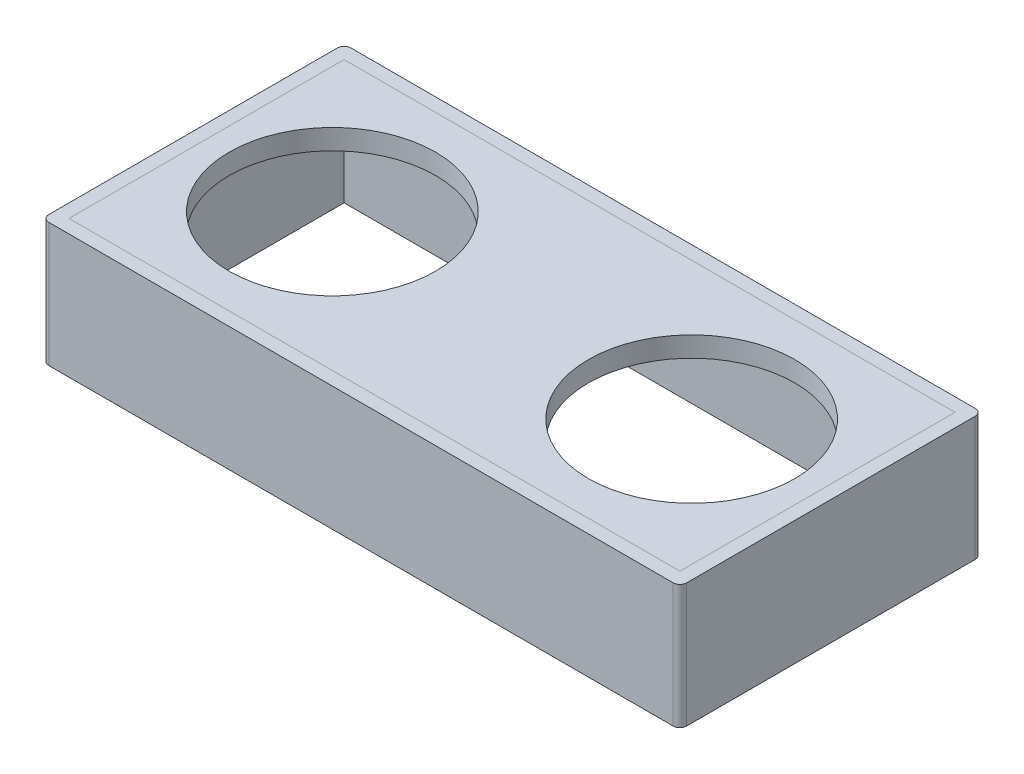
ISO-10303-21;
HEADER;
FILE_DESCRIPTION(('STEP AP214'),'2;1');
FILE_NAME('part.step','',(''),(''),'','','');
FILE_SCHEMA(('AUTOMOTIVE_DESIGN { 1 0 10303 214 1 1 1 1 }'));
ENDSEC;
DATA;
#1=APPLICATION_CONTEXT('core data for automotive mechanical design processes');
#2=APPLICATION_PROTOCOL_DEFINITION('international standard','automotive_design',2000,#1);
#3=PRODUCT_CONTEXT('',#1,'mechanical');
#4=PRODUCT('Part','Part','',(#3));
#5=PRODUCT_RELATED_PRODUCT_CATEGORY('part','',(#4));
#6=PRODUCT_DEFINITION_FORMATION('','',#4);
#7=PRODUCT_DEFINITION_CONTEXT('part definition',#1,'design');
#8=PRODUCT_DEFINITION('design','',#6,#7);
#9=PRODUCT_DEFINITION_SHAPE('','',#8);
#10=(LENGTH_UNIT() NAMED_UNIT(*) SI_UNIT(.MILLI.,.METRE.));
#11=(NAMED_UNIT(*) PLANE_ANGLE_UNIT() SI_UNIT($,.RADIAN.));
#12=(NAMED_UNIT(*) SI_UNIT($,.STERADIAN.) SOLID_ANGLE_UNIT());
#13=UNCERTAINTY_MEASURE_WITH_UNIT(LENGTH_MEASURE(1.E-05),#10,'distance_accuracy_value','');
#14=(GEOMETRIC_REPRESENTATION_CONTEXT(3) GLOBAL_UNCERTAINTY_ASSIGNED_CONTEXT((#13)) GLOBAL_UNIT_ASSIGNED_CONTEXT((#10,
#11,#12)) REPRESENTATION_CONTEXT('',''));
#15=CARTESIAN_POINT('',(0.,0.,0.));
#16=DIRECTION('',(0.,0.,1.));
#17=DIRECTION('',(1.,0.,0.));
#18=AXIS2_PLACEMENT_3D('',#15,#16,#17);
#19=CARTESIAN_POINT('',(24.0480834335101,53.8359341179653,10.2231229798815));
#20=DIRECTION('',(0.,-1.,0.));
#21=DIRECTION('',(0.,0.,-1.));
#22=AXIS2_PLACEMENT_3D('',#19,#20,#21);
#23=CYLINDRICAL_SURFACE('',#22,0.5);
#24=DIRECTION('',(0.,-1.,0.));
#25=VECTOR('',#24,1.);
#26=CARTESIAN_POINT('',(24.5480834335101,53.8359341179653,10.2231229798815));
#27=LINE('',#26,#25);
#28=CARTESIAN_POINT('',(24.5480834335101,1.5,10.2231229798815));
#29=VERTEX_POINT('',#28);
#30=CARTESIAN_POINT('',(24.5480834335101,-7.7,10.2231229798815));
#31=VERTEX_POINT('',#30);
#32=EDGE_CURVE('E194',#29,#31,#27,.T.);
#33=ORIENTED_EDGE('',*,*,#32,.F.);
#34=CARTESIAN_POINT('',(24.0480834335101,1.5,10.2231229798815));
#35=DIRECTION('',(0.,1.,0.));
#36=DIRECTION('',(0.,0.,1.));
#37=AXIS2_PLACEMENT_3D('',#34,#35,#36);
#38=CIRCLE('',#37,0.5);
#39=CARTESIAN_POINT('',(24.0480834335101,1.5,10.7231229798815));
#40=VERTEX_POINT('',#39);
#41=EDGE_CURVE('E181',#29,#40,#38,.F.);
#42=ORIENTED_EDGE('',*,*,#41,.T.);
#43=DIRECTION('',(0.,-1.,0.));
#44=VECTOR('',#43,1.);
#45=CARTESIAN_POINT('',(24.0480834335101,53.8359341179653,10.7231229798815));
#46=LINE('',#45,#44);
#47=CARTESIAN_POINT('',(24.0480834335101,-7.7,10.7231229798815));
#48=VERTEX_POINT('',#47);
#49=EDGE_CURVE('E190',#40,#48,#46,.T.);
#50=ORIENTED_EDGE('',*,*,#49,.T.);
#51=CARTESIAN_POINT('',(24.0480834335101,-7.7,10.2231229798815));
#52=DIRECTION('',(0.,-1.,0.));
#53=DIRECTION('',(0.,0.,-1.));
#54=AXIS2_PLACEMENT_3D('',#51,#52,#53);
#55=CIRCLE('',#54,0.5);
#56=EDGE_CURVE('E157',#31,#48,#55,.T.);
#57=ORIENTED_EDGE('',*,*,#56,.F.);
#58=EDGE_LOOP('',(#33,#42,#50,#57));
#59=FACE_BOUND('',#58,.T.);
#60=ADVANCED_FACE('F43',(#59),#23,.T.);
#61=CARTESIAN_POINT('',(24.5480834335101,53.8359341179653,-11.1768770201185));
#62=DIRECTION('',(1.,0.,0.));
#63=DIRECTION('',(0.,0.,-1.));
#64=AXIS2_PLACEMENT_3D('',#61,#62,#63);
#65=PLANE('',#64);
#66=DIRECTION('',(0.,-1.,0.));
#67=VECTOR('',#66,1.);
#68=CARTESIAN_POINT('',(24.5480834335101,53.8359341179653,-11.1768770201185));
#69=LINE('',#68,#67);
#70=CARTESIAN_POINT('',(24.5480834335101,1.5,-11.1768770201185));
#71=VERTEX_POINT('',#70);
#72=CARTESIAN_POINT('',(24.5480834335101,-7.7,-11.1768770201185));
#73=VERTEX_POINT('',#72);
#74=EDGE_CURVE('E198',#71,#73,#69,.T.);
#75=ORIENTED_EDGE('',*,*,#74,.F.);
#76=DIRECTION('',(0.,0.,1.));
#77=VECTOR('',#76,1.);
#78=CARTESIAN_POINT('',(24.5480834335101,1.5,-11.1768770201185));
#79=LINE('',#78,#77);
#80=EDGE_CURVE('E191',#71,#29,#79,.T.);
#81=ORIENTED_EDGE('',*,*,#80,.T.);
#82=ORIENTED_EDGE('',*,*,#32,.T.);
#83=DIRECTION('',(0.,0.,1.));
#84=VECTOR('',#83,1.);
#85=CARTESIAN_POINT('',(24.5480834335101,-7.7,-11.1768770201185));
#86=LINE('',#85,#84);
#87=EDGE_CURVE('E178',#73,#31,#86,.T.);
#88=ORIENTED_EDGE('',*,*,#87,.F.);
#89=EDGE_LOOP('',(#75,#81,#82,#88));
#90=FACE_BOUND('',#89,.T.);
#91=ADVANCED_FACE('F241',(#90),#65,.T.);
#92=CARTESIAN_POINT('',(24.0480834335101,53.8359341179653,-11.1768770201185));
#93=DIRECTION('',(0.,-1.,0.));
#94=DIRECTION('',(0.,0.,-1.));
#95=AXIS2_PLACEMENT_3D('',#92,#93,#94);
#96=CYLINDRICAL_SURFACE('',#95,0.5);
#97=DIRECTION('',(0.,-1.,0.));
#98=VECTOR('',#97,1.);
#99=CARTESIAN_POINT('',(24.0480834335101,53.8359341179653,-11.6768770201185));
#100=LINE('',#99,#98);
#101=CARTESIAN_POINT('',(24.0480834335101,1.5,-11.6768770201185));
#102=VERTEX_POINT('',#101);
#103=CARTESIAN_POINT('',(24.0480834335101,-7.7,-11.6768770201185));
#104=VERTEX_POINT('',#103);
#105=EDGE_CURVE('E202',#102,#104,#100,.T.);
#106=ORIENTED_EDGE('',*,*,#105,.F.);
#107=CARTESIAN_POINT('',(24.0480834335101,1.5,-11.1768770201185));
#108=DIRECTION('',(0.,1.,0.));
#109=DIRECTION('',(0.,0.,1.));
#110=AXIS2_PLACEMENT_3D('',#107,#108,#109);
#111=CIRCLE('',#110,0.5);
#112=EDGE_CURVE('E195',#102,#71,#111,.F.);
#113=ORIENTED_EDGE('',*,*,#112,.T.);
#114=ORIENTED_EDGE('',*,*,#74,.T.);
#115=CARTESIAN_POINT('',(24.0480834335101,-7.7,-11.1768770201185));
#116=DIRECTION('',(0.,-1.,0.));
#117=DIRECTION('',(0.,0.,-1.));
#118=AXIS2_PLACEMENT_3D('',#115,#116,#117);
#119=CIRCLE('',#118,0.5);
#120=EDGE_CURVE('E175',#104,#73,#119,.T.);
#121=ORIENTED_EDGE('',*,*,#120,.F.);
#122=EDGE_LOOP('',(#106,#113,#114,#121));
#123=FACE_BOUND('',#122,.T.);
#124=ADVANCED_FACE('F247',(#123),#96,.T.);
#125=CARTESIAN_POINT('',(-22.2519165664899,53.8359341179653,-11.6768770201185));
#126=DIRECTION('',(0.,0.,-1.));
#127=DIRECTION('',(-1.,0.,0.));
#128=AXIS2_PLACEMENT_3D('',#125,#126,#127);
#129=PLANE('',#128);
#130=DIRECTION('',(0.,-1.,0.));
#131=VECTOR('',#130,1.);
#132=CARTESIAN_POINT('',(-22.2519165664899,53.8359341179653,-11.6768770201185));
#133=LINE('',#132,#131);
#134=CARTESIAN_POINT('',(-22.2519165664899,1.5,-11.6768770201185));
#135=VERTEX_POINT('',#134);
#136=CARTESIAN_POINT('',(-22.2519165664899,-7.7,-11.6768770201185));
#137=VERTEX_POINT('',#136);
#138=EDGE_CURVE('E206',#135,#137,#133,.T.);
#139=ORIENTED_EDGE('',*,*,#138,.F.);
#140=DIRECTION('',(1.,0.,0.));
#141=VECTOR('',#140,1.);
#142=CARTESIAN_POINT('',(-22.2519165664899,1.5,-11.6768770201185));
#143=LINE('',#142,#141);
#144=EDGE_CURVE('E199',#135,#102,#143,.T.);
#145=ORIENTED_EDGE('',*,*,#144,.T.);
#146=ORIENTED_EDGE('',*,*,#105,.T.);
#147=DIRECTION('',(1.,0.,0.));
#148=VECTOR('',#147,1.);
#149=CARTESIAN_POINT('',(-22.2519165664899,-7.7,-11.6768770201185));
#150=LINE('',#149,#148);
#151=EDGE_CURVE('E172',#137,#104,#150,.T.);
#152=ORIENTED_EDGE('',*,*,#151,.F.);
#153=EDGE_LOOP('',(#139,#145,#146,#152));
#154=FACE_BOUND('',#153,.T.);
#155=ADVANCED_FACE('F273',(#154),#129,.T.);
#156=CARTESIAN_POINT('',(-22.2519165664899,53.8359341179653,-11.1768770201185));
#157=DIRECTION('',(0.,-1.,0.));
#158=DIRECTION('',(0.,0.,-1.));
#159=AXIS2_PLACEMENT_3D('',#156,#157,#158);
#160=CYLINDRICAL_SURFACE('',#159,0.5);
#161=DIRECTION('',(0.,-1.,0.));
#162=VECTOR('',#161,1.);
#163=CARTESIAN_POINT('',(-22.7519165664899,53.8359341179653,-11.1768770201185));
#164=LINE('',#163,#162);
#165=CARTESIAN_POINT('',(-22.7519165664899,1.5,-11.1768770201185));
#166=VERTEX_POINT('',#165);
#167=CARTESIAN_POINT('',(-22.7519165664899,-7.7,-11.1768770201185));
#168=VERTEX_POINT('',#167);
#169=EDGE_CURVE('E210',#166,#168,#164,.T.);
#170=ORIENTED_EDGE('',*,*,#169,.F.);
#171=CARTESIAN_POINT('',(-22.2519165664899,1.5,-11.1768770201185));
#172=DIRECTION('',(0.,1.,0.));
#173=DIRECTION('',(0.,0.,1.));
#174=AXIS2_PLACEMENT_3D('',#171,#172,#173);
#175=CIRCLE('',#174,0.5);
#176=EDGE_CURVE('E203',#166,#135,#175,.F.);
#177=ORIENTED_EDGE('',*,*,#176,.T.);
#178=ORIENTED_EDGE('',*,*,#138,.T.);
#179=CARTESIAN_POINT('',(-22.2519165664899,-7.7,-11.1768770201185));
#180=DIRECTION('',(0.,-1.,0.));
#181=DIRECTION('',(0.,0.,-1.));
#182=AXIS2_PLACEMENT_3D('',#179,#180,#181);
#183=CIRCLE('',#182,0.5);
#184=EDGE_CURVE('E169',#168,#137,#183,.T.);
#185=ORIENTED_EDGE('',*,*,#184,.F.);
#186=EDGE_LOOP('',(#170,#177,#178,#185));
#187=FACE_BOUND('',#186,.T.);
#188=ADVANCED_FACE('F276',(#187),#160,.T.);
#189=CARTESIAN_POINT('',(-22.7519165664899,53.8359341179653,10.2231229798815));
#190=DIRECTION('',(-1.,0.,0.));
#191=DIRECTION('',(0.,0.,1.));
#192=AXIS2_PLACEMENT_3D('',#189,#190,#191);
#193=PLANE('',#192);
#194=DIRECTION('',(0.,-1.,0.));
#195=VECTOR('',#194,1.);
#196=CARTESIAN_POINT('',(-22.7519165664899,53.8359341179653,10.2231229798815));
#197=LINE('',#196,#195);
#198=CARTESIAN_POINT('',(-22.7519165664899,1.5,10.2231229798815));
#199=VERTEX_POINT('',#198);
#200=CARTESIAN_POINT('',(-22.7519165664899,-7.7,10.2231229798815));
#201=VERTEX_POINT('',#200);
#202=EDGE_CURVE('E184',#199,#201,#197,.T.);
#203=ORIENTED_EDGE('',*,*,#202,.F.);
#204=DIRECTION('',(0.,0.,-1.));
#205=VECTOR('',#204,1.);
#206=CARTESIAN_POINT('',(-22.7519165664899,1.5,10.2231229798815));
#207=LINE('',#206,#205);
#208=EDGE_CURVE('E207',#199,#166,#207,.T.);
#209=ORIENTED_EDGE('',*,*,#208,.T.);
#210=ORIENTED_EDGE('',*,*,#169,.T.);
#211=DIRECTION('',(0.,0.,-1.));
#212=VECTOR('',#211,1.);
#213=CARTESIAN_POINT('',(-22.7519165664899,-7.7,10.2231229798815));
#214=LINE('',#213,#212);
#215=EDGE_CURVE('E166',#201,#168,#214,.T.);
#216=ORIENTED_EDGE('',*,*,#215,.F.);
#217=EDGE_LOOP('',(#203,#209,#210,#216));
#218=FACE_BOUND('',#217,.T.);
#219=ADVANCED_FACE('F280',(#218),#193,.T.);
#220=CARTESIAN_POINT('',(-22.2519165664899,53.8359341179653,10.2231229798815));
#221=DIRECTION('',(0.,-1.,0.));
#222=DIRECTION('',(0.,0.,-1.));
#223=AXIS2_PLACEMENT_3D('',#220,#221,#222);
#224=CYLINDRICAL_SURFACE('',#223,0.5);
#225=DIRECTION('',(0.,-1.,0.));
#226=VECTOR('',#225,1.);
#227=CARTESIAN_POINT('',(-22.2519165664899,53.8359341179653,10.7231229798815));
#228=LINE('',#227,#226);
#229=CARTESIAN_POINT('',(-22.2519165664899,1.5,10.7231229798815));
#230=VERTEX_POINT('',#229);
#231=CARTESIAN_POINT('',(-22.2519165664899,-7.7,10.7231229798815));
#232=VERTEX_POINT('',#231);
#233=EDGE_CURVE('E183',#230,#232,#228,.T.);
#234=ORIENTED_EDGE('',*,*,#233,.F.);
#235=CARTESIAN_POINT('',(-22.2519165664899,1.5,10.2231229798815));
#236=DIRECTION('',(0.,1.,0.));
#237=DIRECTION('',(0.,0.,1.));
#238=AXIS2_PLACEMENT_3D('',#235,#236,#237);
#239=CIRCLE('',#238,0.5);
#240=EDGE_CURVE('E211',#230,#199,#239,.F.);
#241=ORIENTED_EDGE('',*,*,#240,.T.);
#242=ORIENTED_EDGE('',*,*,#202,.T.);
#243=CARTESIAN_POINT('',(-22.2519165664899,-7.7,10.2231229798815));
#244=DIRECTION('',(0.,-1.,0.));
#245=DIRECTION('',(0.,0.,1.));
#246=AXIS2_PLACEMENT_3D('',#243,#244,#245);
#247=CIRCLE('',#246,0.5);
#248=EDGE_CURVE('E163',#232,#201,#247,.T.);
#249=ORIENTED_EDGE('',*,*,#248,.F.);
#250=EDGE_LOOP('',(#234,#241,#242,#249));
#251=FACE_BOUND('',#250,.T.);
#252=ADVANCED_FACE('F284',(#251),#224,.T.);
#253=CARTESIAN_POINT('',(24.0480834335101,53.8359341179653,10.7231229798815));
#254=DIRECTION('',(0.,0.,1.));
#255=DIRECTION('',(1.,0.,0.));
#256=AXIS2_PLACEMENT_3D('',#253,#254,#255);
#257=PLANE('',#256);
#258=ORIENTED_EDGE('',*,*,#49,.F.);
#259=DIRECTION('',(-1.,0.,0.));
#260=VECTOR('',#259,1.);
#261=CARTESIAN_POINT('',(24.0480834335101,1.5,10.7231229798815));
#262=LINE('',#261,#260);
#263=EDGE_CURVE('E61',#40,#230,#262,.T.);
#264=ORIENTED_EDGE('',*,*,#263,.T.);
#265=ORIENTED_EDGE('',*,*,#233,.T.);
#266=DIRECTION('',(-1.,0.,0.));
#267=VECTOR('',#266,1.);
#268=CARTESIAN_POINT('',(24.0480834335101,-7.7,10.7231229798815));
#269=LINE('',#268,#267);
#270=EDGE_CURVE('E160',#48,#232,#269,.T.);
#271=ORIENTED_EDGE('',*,*,#270,.F.);
#272=EDGE_LOOP('',(#258,#264,#265,#271));
#273=FACE_BOUND('',#272,.T.);
#274=ADVANCED_FACE('F239',(#273),#257,.T.);
#275=CARTESIAN_POINT('',(23.5480834335101,53.8359341179653,9.72312297988152));
#276=DIRECTION('',(0.,0.,1.));
#277=DIRECTION('',(1.,0.,0.));
#278=AXIS2_PLACEMENT_3D('',#275,#276,#277);
#279=PLANE('',#278);
#280=DIRECTION('',(-1.,0.,0.));
#281=VECTOR('',#280,1.);
#282=CARTESIAN_POINT('',(23.5480834335101,1.5,9.72312297988152));
#283=LINE('',#282,#281);
#284=CARTESIAN_POINT('',(23.5480834335101,1.5,9.72312297988152));
#285=VERTEX_POINT('',#284);
#286=CARTESIAN_POINT('',(-21.7519165664899,1.5,9.72312297988152));
#287=VERTEX_POINT('',#286);
#288=EDGE_CURVE('E185',#285,#287,#283,.T.);
#289=ORIENTED_EDGE('',*,*,#288,.F.);
#290=DIRECTION('',(0.,-1.,0.));
#291=VECTOR('',#290,1.);
#292=CARTESIAN_POINT('',(23.5480834335101,53.8359341179653,9.72312297988152));
#293=LINE('',#292,#291);
#294=CARTESIAN_POINT('',(23.5480834335101,-7.7,9.72312297988152));
#295=VERTEX_POINT('',#294);
#296=EDGE_CURVE('E144',#285,#295,#293,.T.);
#297=ORIENTED_EDGE('',*,*,#296,.T.);
#298=DIRECTION('',(-1.,0.,0.));
#299=VECTOR('',#298,1.);
#300=CARTESIAN_POINT('',(23.5480834335101,-7.7,9.72312297988152));
#301=LINE('',#300,#299);
#302=CARTESIAN_POINT('',(-21.7519165664899,-7.7,9.72312297988152));
#303=VERTEX_POINT('',#302);
#304=EDGE_CURVE('E141',#295,#303,#301,.T.);
#305=ORIENTED_EDGE('',*,*,#304,.T.);
#306=DIRECTION('',(0.,-1.,0.));
#307=VECTOR('',#306,1.);
#308=CARTESIAN_POINT('',(-21.7519165664899,53.8359341179653,9.72312297988152));
#309=LINE('',#308,#307);
#310=EDGE_CURVE('E47',#287,#303,#309,.T.);
#311=ORIENTED_EDGE('',*,*,#310,.F.);
#312=EDGE_LOOP('',(#289,#297,#305,#311));
#313=FACE_BOUND('',#312,.T.);
#314=ADVANCED_FACE('F142',(#313),#279,.F.);
#315=CARTESIAN_POINT('',(23.5480834335101,53.8359341179653,-10.6768770201185));
#316=DIRECTION('',(1.,0.,0.));
#317=DIRECTION('',(0.,0.,-1.));
#318=AXIS2_PLACEMENT_3D('',#315,#316,#317);
#319=PLANE('',#318);
#320=DIRECTION('',(0.,0.,1.));
#321=VECTOR('',#320,1.);
#322=CARTESIAN_POINT('',(23.5480834335101,1.5,-10.6768770201185));
#323=LINE('',#322,#321);
#324=CARTESIAN_POINT('',(23.5480834335101,1.5,-10.6768770201185));
#325=VERTEX_POINT('',#324);
#326=EDGE_CURVE('E138',#325,#285,#323,.T.);
#327=ORIENTED_EDGE('',*,*,#326,.F.);
#328=DIRECTION('',(0.,-1.,0.));
#329=VECTOR('',#328,1.);
#330=CARTESIAN_POINT('',(23.5480834335101,53.8359341179653,-10.6768770201185));
#331=LINE('',#330,#329);
#332=CARTESIAN_POINT('',(23.5480834335101,-7.7,-10.6768770201185));
#333=VERTEX_POINT('',#332);
#334=EDGE_CURVE('E224',#325,#333,#331,.T.);
#335=ORIENTED_EDGE('',*,*,#334,.T.);
#336=DIRECTION('',(0.,0.,1.));
#337=VECTOR('',#336,1.);
#338=CARTESIAN_POINT('',(23.5480834335101,-7.7,-10.6768770201185));
#339=LINE('',#338,#337);
#340=EDGE_CURVE('E153',#333,#295,#339,.T.);
#341=ORIENTED_EDGE('',*,*,#340,.T.);
#342=ORIENTED_EDGE('',*,*,#296,.F.);
#343=EDGE_LOOP('',(#327,#335,#341,#342));
#344=FACE_BOUND('',#343,.T.);
#345=ADVANCED_FACE('F231',(#344),#319,.F.);
#346=CARTESIAN_POINT('',(-21.7519165664899,53.8359341179653,-10.6768770201185));
#347=DIRECTION('',(0.,0.,-1.));
#348=DIRECTION('',(-1.,0.,0.));
#349=AXIS2_PLACEMENT_3D('',#346,#347,#348);
#350=PLANE('',#349);
#351=DIRECTION('',(1.,0.,0.));
#352=VECTOR('',#351,1.);
#353=CARTESIAN_POINT('',(-21.7519165664899,1.5,-10.6768770201185));
#354=LINE('',#353,#352);
#355=CARTESIAN_POINT('',(-21.7519165664899,1.5,-10.6768770201185));
#356=VERTEX_POINT('',#355);
#357=EDGE_CURVE('E12',#356,#325,#354,.T.);
#358=ORIENTED_EDGE('',*,*,#357,.F.);
#359=DIRECTION('',(0.,-1.,0.));
#360=VECTOR('',#359,1.);
#361=CARTESIAN_POINT('',(-21.7519165664899,53.8359341179653,-10.6768770201185));
#362=LINE('',#361,#360);
#363=CARTESIAN_POINT('',(-21.7519165664899,-7.7,-10.6768770201185));
#364=VERTEX_POINT('',#363);
#365=EDGE_CURVE('E139',#356,#364,#362,.T.);
#366=ORIENTED_EDGE('',*,*,#365,.T.);
#367=DIRECTION('',(1.,0.,0.));
#368=VECTOR('',#367,1.);
#369=CARTESIAN_POINT('',(-21.7519165664899,-7.7,-10.6768770201185));
#370=LINE('',#369,#368);
#371=EDGE_CURVE('E151',#364,#333,#370,.T.);
#372=ORIENTED_EDGE('',*,*,#371,.T.);
#373=ORIENTED_EDGE('',*,*,#334,.F.);
#374=EDGE_LOOP('',(#358,#366,#372,#373));
#375=FACE_BOUND('',#374,.T.);
#376=ADVANCED_FACE('F227',(#375),#350,.F.);
#377=CARTESIAN_POINT('',(-21.7519165664899,53.8359341179653,9.72312297988152));
#378=DIRECTION('',(-1.,0.,0.));
#379=DIRECTION('',(0.,0.,1.));
#380=AXIS2_PLACEMENT_3D('',#377,#378,#379);
#381=PLANE('',#380);
#382=DIRECTION('',(0.,0.,-1.));
#383=VECTOR('',#382,1.);
#384=CARTESIAN_POINT('',(-21.7519165664899,1.5,9.72312297988152));
#385=LINE('',#384,#383);
#386=EDGE_CURVE('E53',#287,#356,#385,.T.);
#387=ORIENTED_EDGE('',*,*,#386,.F.);
#388=ORIENTED_EDGE('',*,*,#310,.T.);
#389=DIRECTION('',(0.,0.,-1.));
#390=VECTOR('',#389,1.);
#391=CARTESIAN_POINT('',(-21.7519165664899,-7.7,9.72312297988152));
#392=LINE('',#391,#390);
#393=EDGE_CURVE('E133',#303,#364,#392,.T.);
#394=ORIENTED_EDGE('',*,*,#393,.T.);
#395=ORIENTED_EDGE('',*,*,#365,.F.);
#396=EDGE_LOOP('',(#387,#388,#394,#395));
#397=FACE_BOUND('',#396,.T.);
#398=ADVANCED_FACE('F130',(#397),#381,.F.);
#399=CARTESIAN_POINT('',(0.,1.5,0.));
#400=DIRECTION('',(0.,1.,0.));
#401=DIRECTION('',(0.,0.,1.));
#402=AXIS2_PLACEMENT_3D('',#399,#400,#401);
#403=PLANE('',#402);
#404=ORIENTED_EDGE('',*,*,#41,.F.);
#405=ORIENTED_EDGE('',*,*,#80,.F.);
#406=ORIENTED_EDGE('',*,*,#112,.F.);
#407=ORIENTED_EDGE('',*,*,#144,.F.);
#408=ORIENTED_EDGE('',*,*,#176,.F.);
#409=ORIENTED_EDGE('',*,*,#208,.F.);
#410=ORIENTED_EDGE('',*,*,#240,.F.);
#411=ORIENTED_EDGE('',*,*,#263,.F.);
#412=EDGE_LOOP('',(#404,#405,#406,#407,#408,#409,#410,#411));
#413=FACE_BOUND('',#412,.T.);
#414=ORIENTED_EDGE('',*,*,#326,.T.);
#415=ORIENTED_EDGE('',*,*,#288,.T.);
#416=ORIENTED_EDGE('',*,*,#386,.T.);
#417=ORIENTED_EDGE('',*,*,#357,.T.);
#418=EDGE_LOOP('',(#414,#415,#416,#417));
#419=FACE_BOUND('',#418,.T.);
#420=ADVANCED_FACE('F45',(#413,#419),#403,.T.);
#421=CARTESIAN_POINT('',(24.0480834335101,-7.7,10.2231229798815));
#422=DIRECTION('',(0.,-1.,0.));
#423=DIRECTION('',(0.,0.,-1.));
#424=AXIS2_PLACEMENT_3D('',#421,#422,#423);
#425=PLANE('',#424);
#426=ORIENTED_EDGE('',*,*,#56,.T.);
#427=ORIENTED_EDGE('',*,*,#270,.T.);
#428=ORIENTED_EDGE('',*,*,#248,.T.);
#429=ORIENTED_EDGE('',*,*,#215,.T.);
#430=ORIENTED_EDGE('',*,*,#184,.T.);
#431=ORIENTED_EDGE('',*,*,#151,.T.);
#432=ORIENTED_EDGE('',*,*,#120,.T.);
#433=ORIENTED_EDGE('',*,*,#87,.T.);
#434=EDGE_LOOP('',(#426,#427,#428,#429,#430,#431,#432,#433));
#435=FACE_BOUND('',#434,.T.);
#436=ORIENTED_EDGE('',*,*,#393,.F.);
#437=ORIENTED_EDGE('',*,*,#304,.F.);
#438=ORIENTED_EDGE('',*,*,#340,.F.);
#439=ORIENTED_EDGE('',*,*,#371,.F.);
#440=EDGE_LOOP('',(#436,#437,#438,#439));
#441=FACE_BOUND('',#440,.T.);
#442=ADVANCED_FACE('F149',(#435,#441),#425,.T.);
#443=CLOSED_SHELL('',(#60,#91,#124,#155,#188,#219,#252,#274,#314,#345,#376,#398,#420,#442));
#444=MANIFOLD_SOLID_BREP('B2',#443);
#445=CARTESIAN_POINT('',(0.,1.5,0.));
#446=DIRECTION('',(0.,1.,0.));
#447=DIRECTION('',(0.,0.,1.));
#448=AXIS2_PLACEMENT_3D('',#445,#446,#447);
#449=PLANE('',#448);
#450=CARTESIAN_POINT('',(14.2180834335101,1.5,-0.476877020118483));
#451=DIRECTION('',(0.,1.,0.));
#452=DIRECTION('',(0.,0.,1.));
#453=AXIS2_PLACEMENT_3D('',#450,#451,#452);
#454=CIRCLE('',#453,7.65);
#455=CARTESIAN_POINT('',(14.2180834335101,1.5,7.17312297988152));
#456=VERTEX_POINT('',#455);
#457=EDGE_CURVE('E444',#456,#456,#454,.T.);
#458=ORIENTED_EDGE('',*,*,#457,.F.);
#459=EDGE_LOOP('',(#458));
#460=FACE_BOUND('',#459,.T.);
#461=DIRECTION('',(0.,0.,1.));
#462=VECTOR('',#461,1.);
#463=CARTESIAN_POINT('',(-21.7519165664899,1.5,-10.6768770201185));
#464=LINE('',#463,#462);
#465=CARTESIAN_POINT('',(-21.7519165664899,1.5,-10.6768770201185));
#466=VERTEX_POINT('',#465);
#467=CARTESIAN_POINT('',(-21.7519165664899,1.5,9.72312297988152));
#468=VERTEX_POINT('',#467);
#469=EDGE_CURVE('E429',#466,#468,#464,.T.);
#470=ORIENTED_EDGE('',*,*,#469,.T.);
#471=DIRECTION('',(1.,0.,0.));
#472=VECTOR('',#471,1.);
#473=CARTESIAN_POINT('',(-21.7519165664899,1.5,9.72312297988152));
#474=LINE('',#473,#472);
#475=CARTESIAN_POINT('',(23.5480834335101,1.5,9.72312297988152));
#476=VERTEX_POINT('',#475);
#477=EDGE_CURVE('E424',#468,#476,#474,.T.);
#478=ORIENTED_EDGE('',*,*,#477,.T.);
#479=DIRECTION('',(0.,0.,-1.));
#480=VECTOR('',#479,1.);
#481=CARTESIAN_POINT('',(23.5480834335101,1.5,9.72312297988152));
#482=LINE('',#481,#480);
#483=CARTESIAN_POINT('',(23.5480834335101,1.5,-10.6768770201185));
#484=VERTEX_POINT('',#483);
#485=EDGE_CURVE('E427',#476,#484,#482,.T.);
#486=ORIENTED_EDGE('',*,*,#485,.T.);
#487=DIRECTION('',(-1.,0.,0.));
#488=VECTOR('',#487,1.);
#489=CARTESIAN_POINT('',(23.5480834335101,1.5,-10.6768770201185));
#490=LINE('',#489,#488);
#491=EDGE_CURVE('E394',#484,#466,#490,.T.);
#492=ORIENTED_EDGE('',*,*,#491,.T.);
#493=EDGE_LOOP('',(#470,#478,#486,#492));
#494=FACE_BOUND('',#493,.T.);
#495=CARTESIAN_POINT('',(-12.4219165664899,1.5,-0.476877020118483));
#496=DIRECTION('',(0.,1.,0.));
#497=DIRECTION('',(0.,0.,1.));
#498=AXIS2_PLACEMENT_3D('',#495,#496,#497);
#499=CIRCLE('',#498,7.65);
#500=CARTESIAN_POINT('',(-12.4219165664899,1.5,7.17312297988152));
#501=VERTEX_POINT('',#500);
#502=EDGE_CURVE('E459',#501,#501,#499,.T.);
#503=ORIENTED_EDGE('',*,*,#502,.F.);
#504=EDGE_LOOP('',(#503));
#505=FACE_BOUND('',#504,.T.);
#506=ADVANCED_FACE('F377',(#460,#494,#505),#449,.T.);
#507=CARTESIAN_POINT('',(0.,0.,0.));
#508=DIRECTION('',(0.,1.,0.));
#509=DIRECTION('',(0.,0.,1.));
#510=AXIS2_PLACEMENT_3D('',#507,#508,#509);
#511=PLANE('',#510);
#512=DIRECTION('',(0.,0.,1.));
#513=VECTOR('',#512,1.);
#514=CARTESIAN_POINT('',(-21.7519165664899,0.,-10.6768770201185));
#515=LINE('',#514,#513);
#516=CARTESIAN_POINT('',(-21.7519165664899,0.,-10.6768770201185));
#517=VERTEX_POINT('',#516);
#518=CARTESIAN_POINT('',(-21.7519165664899,0.,9.72312297988152));
#519=VERTEX_POINT('',#518);
#520=EDGE_CURVE('E441',#517,#519,#515,.T.);
#521=ORIENTED_EDGE('',*,*,#520,.F.);
#522=DIRECTION('',(-1.,0.,0.));
#523=VECTOR('',#522,1.);
#524=CARTESIAN_POINT('',(23.5480834335101,0.,-10.6768770201185));
#525=LINE('',#524,#523);
#526=CARTESIAN_POINT('',(23.5480834335101,0.,-10.6768770201185));
#527=VERTEX_POINT('',#526);
#528=EDGE_CURVE('E417',#527,#517,#525,.T.);
#529=ORIENTED_EDGE('',*,*,#528,.F.);
#530=DIRECTION('',(0.,0.,-1.));
#531=VECTOR('',#530,1.);
#532=CARTESIAN_POINT('',(23.5480834335101,0.,9.72312297988152));
#533=LINE('',#532,#531);
#534=CARTESIAN_POINT('',(23.5480834335101,0.,9.72312297988152));
#535=VERTEX_POINT('',#534);
#536=EDGE_CURVE('E411',#535,#527,#533,.T.);
#537=ORIENTED_EDGE('',*,*,#536,.F.);
#538=DIRECTION('',(1.,0.,0.));
#539=VECTOR('',#538,1.);
#540=CARTESIAN_POINT('',(-21.7519165664899,0.,9.72312297988152));
#541=LINE('',#540,#539);
#542=EDGE_CURVE('E433',#519,#535,#541,.T.);
#543=ORIENTED_EDGE('',*,*,#542,.F.);
#544=EDGE_LOOP('',(#521,#529,#537,#543));
#545=FACE_BOUND('',#544,.T.);
#546=CARTESIAN_POINT('',(14.2180834335101,0.,-0.476877020118483));
#547=DIRECTION('',(0.,1.,0.));
#548=DIRECTION('',(0.,0.,1.));
#549=AXIS2_PLACEMENT_3D('',#546,#547,#548);
#550=CIRCLE('',#549,7.65);
#551=CARTESIAN_POINT('',(14.2180834335101,0.,7.17312297988152));
#552=VERTEX_POINT('',#551);
#553=EDGE_CURVE('E456',#552,#552,#550,.T.);
#554=ORIENTED_EDGE('',*,*,#553,.T.);
#555=EDGE_LOOP('',(#554));
#556=FACE_BOUND('',#555,.T.);
#557=CARTESIAN_POINT('',(-12.4219165664899,0.,-0.476877020118483));
#558=DIRECTION('',(0.,1.,0.));
#559=DIRECTION('',(0.,0.,1.));
#560=AXIS2_PLACEMENT_3D('',#557,#558,#559);
#561=CIRCLE('',#560,7.65);
#562=CARTESIAN_POINT('',(-12.4219165664899,0.,7.17312297988152));
#563=VERTEX_POINT('',#562);
#564=EDGE_CURVE('E462',#563,#563,#561,.T.);
#565=ORIENTED_EDGE('',*,*,#564,.T.);
#566=EDGE_LOOP('',(#565));
#567=FACE_BOUND('',#566,.T.);
#568=ADVANCED_FACE('F452',(#545,#556,#567),#511,.F.);
#569=CARTESIAN_POINT('',(-21.7519165664899,1.5,-10.6768770201185));
#570=DIRECTION('',(1.,0.,0.));
#571=DIRECTION('',(0.,0.,-1.));
#572=AXIS2_PLACEMENT_3D('',#569,#570,#571);
#573=PLANE('',#572);
#574=ORIENTED_EDGE('',*,*,#520,.T.);
#575=DIRECTION('',(0.,-1.,0.));
#576=VECTOR('',#575,1.);
#577=CARTESIAN_POINT('',(-21.7519165664899,1.5,9.72312297988152));
#578=LINE('',#577,#576);
#579=EDGE_CURVE('E41',#468,#519,#578,.T.);
#580=ORIENTED_EDGE('',*,*,#579,.F.);
#581=ORIENTED_EDGE('',*,*,#469,.F.);
#582=DIRECTION('',(0.,-1.,0.));
#583=VECTOR('',#582,1.);
#584=CARTESIAN_POINT('',(-21.7519165664899,1.5,-10.6768770201185));
#585=LINE('',#584,#583);
#586=EDGE_CURVE('E437',#466,#517,#585,.T.);
#587=ORIENTED_EDGE('',*,*,#586,.T.);
#588=EDGE_LOOP('',(#574,#580,#581,#587));
#589=FACE_BOUND('',#588,.T.);
#590=ADVANCED_FACE('F379',(#589),#573,.F.);
#591=CARTESIAN_POINT('',(-21.7519165664899,1.5,9.72312297988152));
#592=DIRECTION('',(0.,0.,-1.));
#593=DIRECTION('',(-1.,0.,0.));
#594=AXIS2_PLACEMENT_3D('',#591,#592,#593);
#595=PLANE('',#594);
#596=ORIENTED_EDGE('',*,*,#542,.T.);
#597=DIRECTION('',(0.,-1.,0.));
#598=VECTOR('',#597,1.);
#599=CARTESIAN_POINT('',(23.5480834335101,1.5,9.72312297988152));
#600=LINE('',#599,#598);
#601=EDGE_CURVE('E386',#476,#535,#600,.T.);
#602=ORIENTED_EDGE('',*,*,#601,.F.);
#603=ORIENTED_EDGE('',*,*,#477,.F.);
#604=ORIENTED_EDGE('',*,*,#579,.T.);
#605=EDGE_LOOP('',(#596,#602,#603,#604));
#606=FACE_BOUND('',#605,.T.);
#607=ADVANCED_FACE('F432',(#606),#595,.F.);
#608=CARTESIAN_POINT('',(23.5480834335101,1.5,9.72312297988152));
#609=DIRECTION('',(-1.,0.,0.));
#610=DIRECTION('',(0.,0.,1.));
#611=AXIS2_PLACEMENT_3D('',#608,#609,#610);
#612=PLANE('',#611);
#613=ORIENTED_EDGE('',*,*,#536,.T.);
#614=DIRECTION('',(0.,-1.,0.));
#615=VECTOR('',#614,1.);
#616=CARTESIAN_POINT('',(23.5480834335101,1.5,-10.6768770201185));
#617=LINE('',#616,#615);
#618=EDGE_CURVE('E434',#484,#527,#617,.T.);
#619=ORIENTED_EDGE('',*,*,#618,.F.);
#620=ORIENTED_EDGE('',*,*,#485,.F.);
#621=ORIENTED_EDGE('',*,*,#601,.T.);
#622=EDGE_LOOP('',(#613,#619,#620,#621));
#623=FACE_BOUND('',#622,.T.);
#624=ADVANCED_FACE('F435',(#623),#612,.F.);
#625=CARTESIAN_POINT('',(23.5480834335101,1.5,-10.6768770201185));
#626=DIRECTION('',(0.,0.,1.));
#627=DIRECTION('',(1.,0.,0.));
#628=AXIS2_PLACEMENT_3D('',#625,#626,#627);
#629=PLANE('',#628);
#630=ORIENTED_EDGE('',*,*,#528,.T.);
#631=ORIENTED_EDGE('',*,*,#586,.F.);
#632=ORIENTED_EDGE('',*,*,#491,.F.);
#633=ORIENTED_EDGE('',*,*,#618,.T.);
#634=EDGE_LOOP('',(#630,#631,#632,#633));
#635=FACE_BOUND('',#634,.T.);
#636=ADVANCED_FACE('F449',(#635),#629,.F.);
#637=CARTESIAN_POINT('',(14.2180834335101,1.5,-0.476877020118483));
#638=DIRECTION('',(0.,-1.,0.));
#639=DIRECTION('',(0.,0.,-1.));
#640=AXIS2_PLACEMENT_3D('',#637,#638,#639);
#641=CYLINDRICAL_SURFACE('',#640,7.65);
#642=ORIENTED_EDGE('',*,*,#457,.T.);
#643=EDGE_LOOP('',(#642));
#644=FACE_BOUND('',#643,.T.);
#645=ORIENTED_EDGE('',*,*,#553,.F.);
#646=EDGE_LOOP('',(#645));
#647=FACE_BOUND('',#646,.T.);
#648=ADVANCED_FACE('F479',(#644,#647),#641,.F.);
#649=CARTESIAN_POINT('',(-12.4219165664899,1.5,-0.476877020118483));
#650=DIRECTION('',(0.,-1.,0.));
#651=DIRECTION('',(0.,0.,-1.));
#652=AXIS2_PLACEMENT_3D('',#649,#650,#651);
#653=CYLINDRICAL_SURFACE('',#652,7.65);
#654=ORIENTED_EDGE('',*,*,#502,.T.);
#655=EDGE_LOOP('',(#654));
#656=FACE_BOUND('',#655,.T.);
#657=ORIENTED_EDGE('',*,*,#564,.F.);
#658=EDGE_LOOP('',(#657));
#659=FACE_BOUND('',#658,.T.);
#660=ADVANCED_FACE('F468',(#656,#659),#653,.F.);
#661=CLOSED_SHELL('',(#506,#568,#590,#607,#624,#636,#648,#660));
#662=MANIFOLD_SOLID_BREP('B6',#661);
#663=ADVANCED_BREP_SHAPE_REPRESENTATION('',(#18,#444,#662),#14);
#664=SHAPE_DEFINITION_REPRESENTATION(#9,#663);
ENDSEC;
END-ISO-10303-21;
